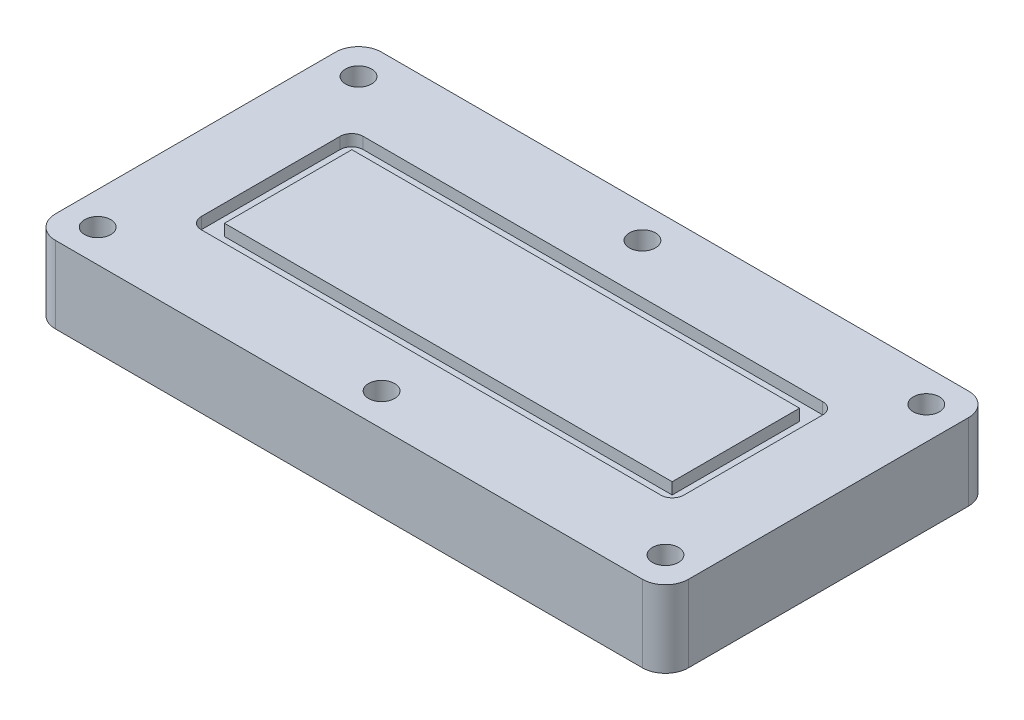
ISO-10303-21;
HEADER;
FILE_DESCRIPTION(('STEP AP214'),'2;1');
FILE_NAME('part.step','',(''),(''),'','','');
FILE_SCHEMA(('AUTOMOTIVE_DESIGN { 1 0 10303 214 1 1 1 1 }'));
ENDSEC;
DATA;
#1=APPLICATION_CONTEXT('core data for automotive mechanical design processes');
#2=APPLICATION_PROTOCOL_DEFINITION('international standard','automotive_design',2000,#1);
#3=PRODUCT_CONTEXT('',#1,'mechanical');
#4=PRODUCT('Part','Part','',(#3));
#5=PRODUCT_RELATED_PRODUCT_CATEGORY('part','',(#4));
#6=PRODUCT_DEFINITION_FORMATION('','',#4);
#7=PRODUCT_DEFINITION_CONTEXT('part definition',#1,'design');
#8=PRODUCT_DEFINITION('design','',#6,#7);
#9=PRODUCT_DEFINITION_SHAPE('','',#8);
#10=(LENGTH_UNIT() NAMED_UNIT(*) SI_UNIT(.MILLI.,.METRE.));
#11=(NAMED_UNIT(*) PLANE_ANGLE_UNIT() SI_UNIT($,.RADIAN.));
#12=(NAMED_UNIT(*) SI_UNIT($,.STERADIAN.) SOLID_ANGLE_UNIT());
#13=UNCERTAINTY_MEASURE_WITH_UNIT(LENGTH_MEASURE(1.E-05),#10,'distance_accuracy_value','');
#14=(GEOMETRIC_REPRESENTATION_CONTEXT(3) GLOBAL_UNCERTAINTY_ASSIGNED_CONTEXT((#13)) GLOBAL_UNIT_ASSIGNED_CONTEXT((#10,
#11,#12)) REPRESENTATION_CONTEXT('',''));
#15=CARTESIAN_POINT('',(0.,0.,0.));
#16=DIRECTION('',(0.,0.,1.));
#17=DIRECTION('',(1.,0.,0.));
#18=AXIS2_PLACEMENT_3D('',#15,#16,#17);
#19=CARTESIAN_POINT('',(-46.99,12.7,21.59));
#20=DIRECTION('',(0.,-1.,0.));
#21=DIRECTION('',(0.,0.,-1.));
#22=AXIS2_PLACEMENT_3D('',#19,#20,#21);
#23=CYLINDRICAL_SURFACE('',#22,2.159);
#24=CARTESIAN_POINT('',(-46.99,12.7,21.59));
#25=DIRECTION('',(0.,-1.,0.));
#26=DIRECTION('',(0.,0.,-1.));
#27=AXIS2_PLACEMENT_3D('',#24,#25,#26);
#28=CIRCLE('',#27,2.159);
#29=CARTESIAN_POINT('',(-46.99,12.7,19.431));
#30=VERTEX_POINT('',#29);
#31=EDGE_CURVE('E220',#30,#30,#28,.T.);
#32=ORIENTED_EDGE('',*,*,#31,.F.);
#33=EDGE_LOOP('',(#32));
#34=FACE_BOUND('',#33,.T.);
#35=CARTESIAN_POINT('',(-46.99,4.572,21.59));
#36=DIRECTION('',(0.,-1.,0.));
#37=DIRECTION('',(0.,0.,-1.));
#38=AXIS2_PLACEMENT_3D('',#35,#36,#37);
#39=CIRCLE('',#38,2.159);
#40=CARTESIAN_POINT('',(-46.99,4.572,19.431));
#41=VERTEX_POINT('',#40);
#42=EDGE_CURVE('E377',#41,#41,#39,.F.);
#43=ORIENTED_EDGE('',*,*,#42,.F.);
#44=EDGE_LOOP('',(#43));
#45=FACE_BOUND('',#44,.T.);
#46=ADVANCED_FACE('F43',(#34,#45),#23,.F.);
#47=CARTESIAN_POINT('',(0.,12.7,-21.59));
#48=DIRECTION('',(0.,-1.,0.));
#49=DIRECTION('',(0.,0.,-1.));
#50=AXIS2_PLACEMENT_3D('',#47,#48,#49);
#51=CYLINDRICAL_SURFACE('',#50,2.159);
#52=CARTESIAN_POINT('',(0.,12.7,-21.59));
#53=DIRECTION('',(0.,-1.,0.));
#54=DIRECTION('',(0.,0.,-1.));
#55=AXIS2_PLACEMENT_3D('',#52,#53,#54);
#56=CIRCLE('',#55,2.159);
#57=CARTESIAN_POINT('',(0.,12.7,-23.749));
#58=VERTEX_POINT('',#57);
#59=EDGE_CURVE('E381',#58,#58,#56,.T.);
#60=ORIENTED_EDGE('',*,*,#59,.F.);
#61=EDGE_LOOP('',(#60));
#62=FACE_BOUND('',#61,.T.);
#63=CARTESIAN_POINT('',(0.,4.572,-21.59));
#64=DIRECTION('',(0.,-1.,0.));
#65=DIRECTION('',(0.,0.,-1.));
#66=AXIS2_PLACEMENT_3D('',#63,#64,#65);
#67=CIRCLE('',#66,2.159);
#68=CARTESIAN_POINT('',(0.,4.572,-23.749));
#69=VERTEX_POINT('',#68);
#70=EDGE_CURVE('E373',#69,#69,#67,.F.);
#71=ORIENTED_EDGE('',*,*,#70,.F.);
#72=EDGE_LOOP('',(#71));
#73=FACE_BOUND('',#72,.T.);
#74=ADVANCED_FACE('F465',(#62,#73),#51,.F.);
#75=CARTESIAN_POINT('',(46.99,12.7,21.59));
#76=DIRECTION('',(0.,-1.,0.));
#77=DIRECTION('',(0.,0.,-1.));
#78=AXIS2_PLACEMENT_3D('',#75,#76,#77);
#79=CYLINDRICAL_SURFACE('',#78,2.159);
#80=CARTESIAN_POINT('',(46.99,12.7,21.59));
#81=DIRECTION('',(0.,-1.,0.));
#82=DIRECTION('',(0.,0.,-1.));
#83=AXIS2_PLACEMENT_3D('',#80,#81,#82);
#84=CIRCLE('',#83,2.159);
#85=CARTESIAN_POINT('',(46.99,12.7,19.431));
#86=VERTEX_POINT('',#85);
#87=EDGE_CURVE('E576',#86,#86,#84,.T.);
#88=ORIENTED_EDGE('',*,*,#87,.F.);
#89=EDGE_LOOP('',(#88));
#90=FACE_BOUND('',#89,.T.);
#91=CARTESIAN_POINT('',(46.99,4.572,21.59));
#92=DIRECTION('',(0.,-1.,0.));
#93=DIRECTION('',(0.,0.,-1.));
#94=AXIS2_PLACEMENT_3D('',#91,#92,#93);
#95=CIRCLE('',#94,2.159);
#96=CARTESIAN_POINT('',(46.99,4.572,19.431));
#97=VERTEX_POINT('',#96);
#98=EDGE_CURVE('E369',#97,#97,#95,.F.);
#99=ORIENTED_EDGE('',*,*,#98,.F.);
#100=EDGE_LOOP('',(#99));
#101=FACE_BOUND('',#100,.T.);
#102=ADVANCED_FACE('F471',(#90,#101),#79,.F.);
#103=CARTESIAN_POINT('',(-46.99,12.7,-21.59));
#104=DIRECTION('',(0.,-1.,0.));
#105=DIRECTION('',(0.,0.,-1.));
#106=AXIS2_PLACEMENT_3D('',#103,#104,#105);
#107=CYLINDRICAL_SURFACE('',#106,2.159);
#108=CARTESIAN_POINT('',(-46.99,12.7,-21.59));
#109=DIRECTION('',(0.,-1.,0.));
#110=DIRECTION('',(0.,0.,-1.));
#111=AXIS2_PLACEMENT_3D('',#108,#109,#110);
#112=CIRCLE('',#111,2.159);
#113=CARTESIAN_POINT('',(-46.99,12.7,-23.749));
#114=VERTEX_POINT('',#113);
#115=EDGE_CURVE('E647',#114,#114,#112,.T.);
#116=ORIENTED_EDGE('',*,*,#115,.F.);
#117=EDGE_LOOP('',(#116));
#118=FACE_BOUND('',#117,.T.);
#119=CARTESIAN_POINT('',(-46.99,4.572,-21.59));
#120=DIRECTION('',(0.,-1.,0.));
#121=DIRECTION('',(0.,0.,-1.));
#122=AXIS2_PLACEMENT_3D('',#119,#120,#121);
#123=CIRCLE('',#122,2.159);
#124=CARTESIAN_POINT('',(-46.99,4.572,-23.749));
#125=VERTEX_POINT('',#124);
#126=EDGE_CURVE('E365',#125,#125,#123,.F.);
#127=ORIENTED_EDGE('',*,*,#126,.F.);
#128=EDGE_LOOP('',(#127));
#129=FACE_BOUND('',#128,.T.);
#130=ADVANCED_FACE('F478',(#118,#129),#107,.F.);
#131=CARTESIAN_POINT('',(46.99,12.7,-21.59));
#132=DIRECTION('',(0.,-1.,0.));
#133=DIRECTION('',(0.,0.,-1.));
#134=AXIS2_PLACEMENT_3D('',#131,#132,#133);
#135=CYLINDRICAL_SURFACE('',#134,2.159);
#136=CARTESIAN_POINT('',(46.99,12.7,-21.59));
#137=DIRECTION('',(0.,-1.,0.));
#138=DIRECTION('',(0.,0.,-1.));
#139=AXIS2_PLACEMENT_3D('',#136,#137,#138);
#140=CIRCLE('',#139,2.159);
#141=CARTESIAN_POINT('',(46.99,12.7,-23.749));
#142=VERTEX_POINT('',#141);
#143=EDGE_CURVE('E643',#142,#142,#140,.T.);
#144=ORIENTED_EDGE('',*,*,#143,.F.);
#145=EDGE_LOOP('',(#144));
#146=FACE_BOUND('',#145,.T.);
#147=CARTESIAN_POINT('',(46.99,4.572,-21.59));
#148=DIRECTION('',(0.,-1.,0.));
#149=DIRECTION('',(0.,0.,-1.));
#150=AXIS2_PLACEMENT_3D('',#147,#148,#149);
#151=CIRCLE('',#150,2.159);
#152=CARTESIAN_POINT('',(46.99,4.572,-23.749));
#153=VERTEX_POINT('',#152);
#154=EDGE_CURVE('E360',#153,#153,#151,.F.);
#155=ORIENTED_EDGE('',*,*,#154,.F.);
#156=EDGE_LOOP('',(#155));
#157=FACE_BOUND('',#156,.T.);
#158=ADVANCED_FACE('F561',(#146,#157),#135,.F.);
#159=CARTESIAN_POINT('',(0.,12.7,21.59));
#160=DIRECTION('',(0.,-1.,0.));
#161=DIRECTION('',(0.,0.,-1.));
#162=AXIS2_PLACEMENT_3D('',#159,#160,#161);
#163=CYLINDRICAL_SURFACE('',#162,2.159);
#164=CARTESIAN_POINT('',(0.,12.7,21.59));
#165=DIRECTION('',(0.,-1.,0.));
#166=DIRECTION('',(0.,0.,-1.));
#167=AXIS2_PLACEMENT_3D('',#164,#165,#166);
#168=CIRCLE('',#167,2.159);
#169=CARTESIAN_POINT('',(0.,12.7,19.431));
#170=VERTEX_POINT('',#169);
#171=EDGE_CURVE('E642',#170,#170,#168,.T.);
#172=ORIENTED_EDGE('',*,*,#171,.F.);
#173=EDGE_LOOP('',(#172));
#174=FACE_BOUND('',#173,.T.);
#175=CARTESIAN_POINT('',(0.,4.572,21.59));
#176=DIRECTION('',(0.,-1.,0.));
#177=DIRECTION('',(0.,0.,-1.));
#178=AXIS2_PLACEMENT_3D('',#175,#176,#177);
#179=CIRCLE('',#178,2.159);
#180=CARTESIAN_POINT('',(0.,4.572,19.431));
#181=VERTEX_POINT('',#180);
#182=EDGE_CURVE('E356',#181,#181,#179,.F.);
#183=ORIENTED_EDGE('',*,*,#182,.F.);
#184=EDGE_LOOP('',(#183));
#185=FACE_BOUND('',#184,.T.);
#186=ADVANCED_FACE('F525',(#174,#185),#163,.F.);
#187=CARTESIAN_POINT('',(52.3875,12.7,26.9875));
#188=DIRECTION('',(-1.,0.,0.));
#189=DIRECTION('',(0.,0.,1.));
#190=AXIS2_PLACEMENT_3D('',#187,#188,#189);
#191=PLANE('',#190);
#192=DIRECTION('',(0.,0.,-1.));
#193=VECTOR('',#192,1.);
#194=CARTESIAN_POINT('',(52.3875,12.7,26.9875));
#195=LINE('',#194,#193);
#196=CARTESIAN_POINT('',(52.3875,12.7,23.1775));
#197=VERTEX_POINT('',#196);
#198=CARTESIAN_POINT('',(52.3875,12.7,-23.1775));
#199=VERTEX_POINT('',#198);
#200=EDGE_CURVE('E275',#197,#199,#195,.T.);
#201=ORIENTED_EDGE('',*,*,#200,.F.);
#202=DIRECTION('',(0.,-1.,0.));
#203=VECTOR('',#202,1.);
#204=CARTESIAN_POINT('',(52.3875,12.7,23.1775));
#205=LINE('',#204,#203);
#206=CARTESIAN_POINT('',(52.3875,0.,23.1775));
#207=VERTEX_POINT('',#206);
#208=EDGE_CURVE('E11',#197,#207,#205,.T.);
#209=ORIENTED_EDGE('',*,*,#208,.T.);
#210=DIRECTION('',(0.,0.,-1.));
#211=VECTOR('',#210,1.);
#212=CARTESIAN_POINT('',(52.3875,0.,26.9875));
#213=LINE('',#212,#211);
#214=CARTESIAN_POINT('',(52.3875,0.,-23.1775));
#215=VERTEX_POINT('',#214);
#216=EDGE_CURVE('E260',#207,#215,#213,.T.);
#217=ORIENTED_EDGE('',*,*,#216,.T.);
#218=DIRECTION('',(0.,-1.,0.));
#219=VECTOR('',#218,1.);
#220=CARTESIAN_POINT('',(52.3875,12.7,-23.1775));
#221=LINE('',#220,#219);
#222=EDGE_CURVE('E52',#215,#199,#221,.F.);
#223=ORIENTED_EDGE('',*,*,#222,.T.);
#224=EDGE_LOOP('',(#201,#209,#217,#223));
#225=FACE_BOUND('',#224,.T.);
#226=ADVANCED_FACE('F427',(#225),#191,.F.);
#227=CARTESIAN_POINT('',(-52.3875,12.7,-26.9875));
#228=DIRECTION('',(0.,0.,1.));
#229=DIRECTION('',(1.,0.,0.));
#230=AXIS2_PLACEMENT_3D('',#227,#228,#229);
#231=PLANE('',#230);
#232=DIRECTION('',(-1.,0.,0.));
#233=VECTOR('',#232,1.);
#234=CARTESIAN_POINT('',(-52.3875,0.,-26.9875));
#235=LINE('',#234,#233);
#236=CARTESIAN_POINT('',(48.5775,0.,-26.9875));
#237=VERTEX_POINT('',#236);
#238=CARTESIAN_POINT('',(-48.5775,0.,-26.9875));
#239=VERTEX_POINT('',#238);
#240=EDGE_CURVE('E294',#237,#239,#235,.T.);
#241=ORIENTED_EDGE('',*,*,#240,.T.);
#242=DIRECTION('',(0.,-1.,0.));
#243=VECTOR('',#242,1.);
#244=CARTESIAN_POINT('',(-48.5775,12.7,-26.9875));
#245=LINE('',#244,#243);
#246=CARTESIAN_POINT('',(-48.5775,12.7,-26.9875));
#247=VERTEX_POINT('',#246);
#248=EDGE_CURVE('E59',#239,#247,#245,.F.);
#249=ORIENTED_EDGE('',*,*,#248,.T.);
#250=DIRECTION('',(-1.,0.,0.));
#251=VECTOR('',#250,1.);
#252=CARTESIAN_POINT('',(-52.3875,12.7,-26.9875));
#253=LINE('',#252,#251);
#254=CARTESIAN_POINT('',(48.5775,12.7,-26.9875));
#255=VERTEX_POINT('',#254);
#256=EDGE_CURVE('E278',#255,#247,#253,.T.);
#257=ORIENTED_EDGE('',*,*,#256,.F.);
#258=DIRECTION('',(0.,-1.,0.));
#259=VECTOR('',#258,1.);
#260=CARTESIAN_POINT('',(48.5775,12.7,-26.9875));
#261=LINE('',#260,#259);
#262=EDGE_CURVE('E418',#255,#237,#261,.T.);
#263=ORIENTED_EDGE('',*,*,#262,.T.);
#264=EDGE_LOOP('',(#241,#249,#257,#263));
#265=FACE_BOUND('',#264,.T.);
#266=ADVANCED_FACE('F435',(#265),#231,.F.);
#267=CARTESIAN_POINT('',(-52.3875,12.7,26.9875));
#268=DIRECTION('',(1.,0.,0.));
#269=DIRECTION('',(0.,0.,-1.));
#270=AXIS2_PLACEMENT_3D('',#267,#268,#269);
#271=PLANE('',#270);
#272=DIRECTION('',(0.,0.,1.));
#273=VECTOR('',#272,1.);
#274=CARTESIAN_POINT('',(-52.3875,0.,26.9875));
#275=LINE('',#274,#273);
#276=CARTESIAN_POINT('',(-52.3875,0.,-23.1775));
#277=VERTEX_POINT('',#276);
#278=CARTESIAN_POINT('',(-52.3875,0.,23.1775));
#279=VERTEX_POINT('',#278);
#280=EDGE_CURVE('E297',#277,#279,#275,.T.);
#281=ORIENTED_EDGE('',*,*,#280,.T.);
#282=DIRECTION('',(0.,-1.,0.));
#283=VECTOR('',#282,1.);
#284=CARTESIAN_POINT('',(-52.3875,12.7,23.1775));
#285=LINE('',#284,#283);
#286=CARTESIAN_POINT('',(-52.3875,12.7,23.1775));
#287=VERTEX_POINT('',#286);
#288=EDGE_CURVE('E404',#279,#287,#285,.F.);
#289=ORIENTED_EDGE('',*,*,#288,.T.);
#290=DIRECTION('',(0.,0.,1.));
#291=VECTOR('',#290,1.);
#292=CARTESIAN_POINT('',(-52.3875,12.7,26.9875));
#293=LINE('',#292,#291);
#294=CARTESIAN_POINT('',(-52.3875,12.7,-23.1775));
#295=VERTEX_POINT('',#294);
#296=EDGE_CURVE('E282',#295,#287,#293,.T.);
#297=ORIENTED_EDGE('',*,*,#296,.F.);
#298=DIRECTION('',(0.,-1.,0.));
#299=VECTOR('',#298,1.);
#300=CARTESIAN_POINT('',(-52.3875,12.7,-23.1775));
#301=LINE('',#300,#299);
#302=EDGE_CURVE('E400',#295,#277,#301,.T.);
#303=ORIENTED_EDGE('',*,*,#302,.T.);
#304=EDGE_LOOP('',(#281,#289,#297,#303));
#305=FACE_BOUND('',#304,.T.);
#306=ADVANCED_FACE('F446',(#305),#271,.F.);
#307=CARTESIAN_POINT('',(-52.3875,12.7,26.9875));
#308=DIRECTION('',(0.,0.,-1.));
#309=DIRECTION('',(-1.,0.,0.));
#310=AXIS2_PLACEMENT_3D('',#307,#308,#309);
#311=PLANE('',#310);
#312=DIRECTION('',(1.,0.,0.));
#313=VECTOR('',#312,1.);
#314=CARTESIAN_POINT('',(-52.3875,12.7,26.9875));
#315=LINE('',#314,#313);
#316=CARTESIAN_POINT('',(-48.5775,12.7,26.9875));
#317=VERTEX_POINT('',#316);
#318=CARTESIAN_POINT('',(48.5775,12.7,26.9875));
#319=VERTEX_POINT('',#318);
#320=EDGE_CURVE('E286',#317,#319,#315,.T.);
#321=ORIENTED_EDGE('',*,*,#320,.F.);
#322=DIRECTION('',(0.,-1.,0.));
#323=VECTOR('',#322,1.);
#324=CARTESIAN_POINT('',(-48.5775,12.7,26.9875));
#325=LINE('',#324,#323);
#326=CARTESIAN_POINT('',(-48.5775,0.,26.9875));
#327=VERTEX_POINT('',#326);
#328=EDGE_CURVE('E384',#317,#327,#325,.T.);
#329=ORIENTED_EDGE('',*,*,#328,.T.);
#330=DIRECTION('',(1.,0.,0.));
#331=VECTOR('',#330,1.);
#332=CARTESIAN_POINT('',(-52.3875,0.,26.9875));
#333=LINE('',#332,#331);
#334=CARTESIAN_POINT('',(48.5775,0.,26.9875));
#335=VERTEX_POINT('',#334);
#336=EDGE_CURVE('E279',#327,#335,#333,.T.);
#337=ORIENTED_EDGE('',*,*,#336,.T.);
#338=DIRECTION('',(0.,-1.,0.));
#339=VECTOR('',#338,1.);
#340=CARTESIAN_POINT('',(48.5775,12.7,26.9875));
#341=LINE('',#340,#339);
#342=EDGE_CURVE('E355',#335,#319,#341,.F.);
#343=ORIENTED_EDGE('',*,*,#342,.T.);
#344=EDGE_LOOP('',(#321,#329,#337,#343));
#345=FACE_BOUND('',#344,.T.);
#346=ADVANCED_FACE('F454',(#345),#311,.F.);
#347=CARTESIAN_POINT('',(0.,12.7,0.));
#348=DIRECTION('',(0.,-1.,0.));
#349=DIRECTION('',(0.,0.,-1.));
#350=AXIS2_PLACEMENT_3D('',#347,#348,#349);
#351=PLANE('',#350);
#352=ORIENTED_EDGE('',*,*,#171,.T.);
#353=EDGE_LOOP('',(#352));
#354=FACE_BOUND('',#353,.T.);
#355=ORIENTED_EDGE('',*,*,#143,.T.);
#356=EDGE_LOOP('',(#355));
#357=FACE_BOUND('',#356,.T.);
#358=ORIENTED_EDGE('',*,*,#115,.T.);
#359=EDGE_LOOP('',(#358));
#360=FACE_BOUND('',#359,.T.);
#361=ORIENTED_EDGE('',*,*,#87,.T.);
#362=EDGE_LOOP('',(#361));
#363=FACE_BOUND('',#362,.T.);
#364=ORIENTED_EDGE('',*,*,#59,.T.);
#365=EDGE_LOOP('',(#364));
#366=FACE_BOUND('',#365,.T.);
#367=ORIENTED_EDGE('',*,*,#31,.T.);
#368=EDGE_LOOP('',(#367));
#369=FACE_BOUND('',#368,.T.);
#370=DIRECTION('',(-1.,0.,0.));
#371=VECTOR('',#370,1.);
#372=CARTESIAN_POINT('',(-39.9415,12.7,-13.3985));
#373=LINE('',#372,#371);
#374=CARTESIAN_POINT('',(38.0365,12.7,-13.3985));
#375=VERTEX_POINT('',#374);
#376=CARTESIAN_POINT('',(-38.0365,12.7,-13.3985));
#377=VERTEX_POINT('',#376);
#378=EDGE_CURVE('E264',#375,#377,#373,.T.);
#379=ORIENTED_EDGE('',*,*,#378,.F.);
#380=CARTESIAN_POINT('',(38.0365,12.7,-11.4935));
#381=DIRECTION('',(0.,-1.,0.));
#382=DIRECTION('',(0.,0.,-1.));
#383=AXIS2_PLACEMENT_3D('',#380,#381,#382);
#384=CIRCLE('',#383,1.905);
#385=CARTESIAN_POINT('',(39.9415,12.7,-11.4935));
#386=VERTEX_POINT('',#385);
#387=EDGE_CURVE('E346',#375,#386,#384,.T.);
#388=ORIENTED_EDGE('',*,*,#387,.T.);
#389=DIRECTION('',(0.,0.,-1.));
#390=VECTOR('',#389,1.);
#391=CARTESIAN_POINT('',(39.9415,12.7,13.3985));
#392=LINE('',#391,#390);
#393=CARTESIAN_POINT('',(39.9415,12.7,11.4935));
#394=VERTEX_POINT('',#393);
#395=EDGE_CURVE('E237',#394,#386,#392,.T.);
#396=ORIENTED_EDGE('',*,*,#395,.F.);
#397=CARTESIAN_POINT('',(38.0365,12.7,11.4935));
#398=DIRECTION('',(0.,-1.,0.));
#399=DIRECTION('',(0.,0.,-1.));
#400=AXIS2_PLACEMENT_3D('',#397,#398,#399);
#401=CIRCLE('',#400,1.905);
#402=CARTESIAN_POINT('',(38.0365,12.7,13.3985));
#403=VERTEX_POINT('',#402);
#404=EDGE_CURVE('E343',#394,#403,#401,.T.);
#405=ORIENTED_EDGE('',*,*,#404,.T.);
#406=DIRECTION('',(1.,0.,0.));
#407=VECTOR('',#406,1.);
#408=CARTESIAN_POINT('',(-39.9415,12.7,13.3985));
#409=LINE('',#408,#407);
#410=CARTESIAN_POINT('',(-38.0365,12.7,13.3985));
#411=VERTEX_POINT('',#410);
#412=EDGE_CURVE('E248',#411,#403,#409,.T.);
#413=ORIENTED_EDGE('',*,*,#412,.F.);
#414=CARTESIAN_POINT('',(-38.0365,12.7,11.4935));
#415=DIRECTION('',(0.,-1.,0.));
#416=DIRECTION('',(0.,0.,-1.));
#417=AXIS2_PLACEMENT_3D('',#414,#415,#416);
#418=CIRCLE('',#417,1.905);
#419=CARTESIAN_POINT('',(-39.9415,12.7,11.4935));
#420=VERTEX_POINT('',#419);
#421=EDGE_CURVE('E349',#411,#420,#418,.T.);
#422=ORIENTED_EDGE('',*,*,#421,.T.);
#423=DIRECTION('',(0.,0.,1.));
#424=VECTOR('',#423,1.);
#425=CARTESIAN_POINT('',(-39.9415,12.7,13.3985));
#426=LINE('',#425,#424);
#427=CARTESIAN_POINT('',(-39.9415,12.7,-11.4935));
#428=VERTEX_POINT('',#427);
#429=EDGE_CURVE('E268',#428,#420,#426,.T.);
#430=ORIENTED_EDGE('',*,*,#429,.F.);
#431=CARTESIAN_POINT('',(-38.0365,12.7,-11.4935));
#432=DIRECTION('',(0.,-1.,0.));
#433=DIRECTION('',(0.,0.,-1.));
#434=AXIS2_PLACEMENT_3D('',#431,#432,#433);
#435=CIRCLE('',#434,1.905);
#436=EDGE_CURVE('E352',#428,#377,#435,.T.);
#437=ORIENTED_EDGE('',*,*,#436,.T.);
#438=EDGE_LOOP('',(#379,#388,#396,#405,#413,#422,#430,#437));
#439=FACE_BOUND('',#438,.T.);
#440=ORIENTED_EDGE('',*,*,#296,.T.);
#441=CARTESIAN_POINT('',(-48.5775,12.7,23.1775));
#442=DIRECTION('',(0.,-1.,0.));
#443=DIRECTION('',(0.,0.,-1.));
#444=AXIS2_PLACEMENT_3D('',#441,#442,#443);
#445=CIRCLE('',#444,3.81);
#446=EDGE_CURVE('E415',#287,#317,#445,.F.);
#447=ORIENTED_EDGE('',*,*,#446,.T.);
#448=ORIENTED_EDGE('',*,*,#320,.T.);
#449=CARTESIAN_POINT('',(48.5775,12.7,23.1775));
#450=DIRECTION('',(0.,-1.,0.));
#451=DIRECTION('',(0.,0.,-1.));
#452=AXIS2_PLACEMENT_3D('',#449,#450,#451);
#453=CIRCLE('',#452,3.81);
#454=EDGE_CURVE('E409',#319,#197,#453,.F.);
#455=ORIENTED_EDGE('',*,*,#454,.T.);
#456=ORIENTED_EDGE('',*,*,#200,.T.);
#457=CARTESIAN_POINT('',(48.5775,12.7,-23.1775));
#458=DIRECTION('',(0.,-1.,0.));
#459=DIRECTION('',(0.,0.,-1.));
#460=AXIS2_PLACEMENT_3D('',#457,#458,#459);
#461=CIRCLE('',#460,3.81);
#462=EDGE_CURVE('E66',#199,#255,#461,.F.);
#463=ORIENTED_EDGE('',*,*,#462,.T.);
#464=ORIENTED_EDGE('',*,*,#256,.T.);
#465=CARTESIAN_POINT('',(-48.5775,12.7,-23.1775));
#466=DIRECTION('',(0.,-1.,0.));
#467=DIRECTION('',(0.,0.,-1.));
#468=AXIS2_PLACEMENT_3D('',#465,#466,#467);
#469=CIRCLE('',#468,3.81);
#470=EDGE_CURVE('E412',#247,#295,#469,.F.);
#471=ORIENTED_EDGE('',*,*,#470,.T.);
#472=EDGE_LOOP('',(#440,#447,#448,#455,#456,#463,#464,#471));
#473=FACE_BOUND('',#472,.T.);
#474=ADVANCED_FACE('F431',(#354,#357,#360,#363,#366,#369,#439,#473),#351,.F.);
#475=CARTESIAN_POINT('',(0.,0.,0.));
#476=DIRECTION('',(0.,-1.,0.));
#477=DIRECTION('',(0.,0.,-1.));
#478=AXIS2_PLACEMENT_3D('',#475,#476,#477);
#479=PLANE('',#478);
#480=CARTESIAN_POINT('',(-46.99,0.,-21.59));
#481=DIRECTION('',(0.,-1.,0.));
#482=DIRECTION('',(0.,0.,-1.));
#483=AXIS2_PLACEMENT_3D('',#480,#481,#482);
#484=CIRCLE('',#483,3.6195);
#485=CARTESIAN_POINT('',(-46.99,0.,-25.2095));
#486=VERTEX_POINT('',#485);
#487=EDGE_CURVE('E623',#486,#486,#484,.T.);
#488=ORIENTED_EDGE('',*,*,#487,.F.);
#489=EDGE_LOOP('',(#488));
#490=FACE_BOUND('',#489,.T.);
#491=CARTESIAN_POINT('',(0.,0.,-21.59));
#492=DIRECTION('',(0.,-1.,0.));
#493=DIRECTION('',(0.,0.,-1.));
#494=AXIS2_PLACEMENT_3D('',#491,#492,#493);
#495=CIRCLE('',#494,3.6195);
#496=CARTESIAN_POINT('',(0.,0.,-25.2095));
#497=VERTEX_POINT('',#496);
#498=EDGE_CURVE('E708',#497,#497,#495,.T.);
#499=ORIENTED_EDGE('',*,*,#498,.F.);
#500=EDGE_LOOP('',(#499));
#501=FACE_BOUND('',#500,.T.);
#502=CARTESIAN_POINT('',(46.99,0.,-21.59));
#503=DIRECTION('',(0.,-1.,0.));
#504=DIRECTION('',(0.,0.,-1.));
#505=AXIS2_PLACEMENT_3D('',#502,#503,#504);
#506=CIRCLE('',#505,3.6195);
#507=CARTESIAN_POINT('',(46.99,0.,-25.2095));
#508=VERTEX_POINT('',#507);
#509=EDGE_CURVE('E700',#508,#508,#506,.T.);
#510=ORIENTED_EDGE('',*,*,#509,.F.);
#511=EDGE_LOOP('',(#510));
#512=FACE_BOUND('',#511,.T.);
#513=CARTESIAN_POINT('',(46.99,0.,21.59));
#514=DIRECTION('',(0.,-1.,0.));
#515=DIRECTION('',(0.,0.,-1.));
#516=AXIS2_PLACEMENT_3D('',#513,#514,#515);
#517=CIRCLE('',#516,3.6195);
#518=CARTESIAN_POINT('',(46.99,0.,17.9705));
#519=VERTEX_POINT('',#518);
#520=EDGE_CURVE('E693',#519,#519,#517,.T.);
#521=ORIENTED_EDGE('',*,*,#520,.F.);
#522=EDGE_LOOP('',(#521));
#523=FACE_BOUND('',#522,.T.);
#524=CARTESIAN_POINT('',(0.,0.,21.59));
#525=DIRECTION('',(0.,-1.,0.));
#526=DIRECTION('',(0.,0.,-1.));
#527=AXIS2_PLACEMENT_3D('',#524,#525,#526);
#528=CIRCLE('',#527,3.6195);
#529=CARTESIAN_POINT('',(0.,0.,17.9705));
#530=VERTEX_POINT('',#529);
#531=EDGE_CURVE('E638',#530,#530,#528,.T.);
#532=ORIENTED_EDGE('',*,*,#531,.F.);
#533=EDGE_LOOP('',(#532));
#534=FACE_BOUND('',#533,.T.);
#535=CARTESIAN_POINT('',(-46.99,0.,21.59));
#536=DIRECTION('',(0.,-1.,0.));
#537=DIRECTION('',(0.,0.,-1.));
#538=AXIS2_PLACEMENT_3D('',#535,#536,#537);
#539=CIRCLE('',#538,3.6195);
#540=CARTESIAN_POINT('',(-46.99,0.,17.9705));
#541=VERTEX_POINT('',#540);
#542=EDGE_CURVE('E634',#541,#541,#539,.T.);
#543=ORIENTED_EDGE('',*,*,#542,.F.);
#544=EDGE_LOOP('',(#543));
#545=FACE_BOUND('',#544,.T.);
#546=ORIENTED_EDGE('',*,*,#336,.F.);
#547=CARTESIAN_POINT('',(-48.5775,0.,23.1775));
#548=DIRECTION('',(0.,-1.,0.));
#549=DIRECTION('',(0.,0.,-1.));
#550=AXIS2_PLACEMENT_3D('',#547,#548,#549);
#551=CIRCLE('',#550,3.81);
#552=EDGE_CURVE('E397',#327,#279,#551,.T.);
#553=ORIENTED_EDGE('',*,*,#552,.T.);
#554=ORIENTED_EDGE('',*,*,#280,.F.);
#555=CARTESIAN_POINT('',(-48.5775,0.,-23.1775));
#556=DIRECTION('',(0.,-1.,0.));
#557=DIRECTION('',(0.,0.,-1.));
#558=AXIS2_PLACEMENT_3D('',#555,#556,#557);
#559=CIRCLE('',#558,3.81);
#560=EDGE_CURVE('E394',#277,#239,#559,.T.);
#561=ORIENTED_EDGE('',*,*,#560,.T.);
#562=ORIENTED_EDGE('',*,*,#240,.F.);
#563=CARTESIAN_POINT('',(48.5775,0.,-23.1775));
#564=DIRECTION('',(0.,-1.,0.));
#565=DIRECTION('',(0.,0.,-1.));
#566=AXIS2_PLACEMENT_3D('',#563,#564,#565);
#567=CIRCLE('',#566,3.81);
#568=EDGE_CURVE('E388',#237,#215,#567,.T.);
#569=ORIENTED_EDGE('',*,*,#568,.T.);
#570=ORIENTED_EDGE('',*,*,#216,.F.);
#571=CARTESIAN_POINT('',(48.5775,0.,23.1775));
#572=DIRECTION('',(0.,-1.,0.));
#573=DIRECTION('',(0.,0.,-1.));
#574=AXIS2_PLACEMENT_3D('',#571,#572,#573);
#575=CIRCLE('',#574,3.81);
#576=EDGE_CURVE('E391',#207,#335,#575,.T.);
#577=ORIENTED_EDGE('',*,*,#576,.T.);
#578=EDGE_LOOP('',(#546,#553,#554,#561,#562,#569,#570,#577));
#579=FACE_BOUND('',#578,.T.);
#580=ADVANCED_FACE('F438',(#490,#501,#512,#523,#534,#545,#579),#479,.T.);
#581=CARTESIAN_POINT('',(39.9415,10.795,13.3985));
#582=DIRECTION('',(1.,0.,0.));
#583=DIRECTION('',(0.,0.,-1.));
#584=AXIS2_PLACEMENT_3D('',#581,#582,#583);
#585=PLANE('',#584);
#586=DIRECTION('',(0.,0.,-1.));
#587=VECTOR('',#586,1.);
#588=CARTESIAN_POINT('',(39.9415,10.795,13.3985));
#589=LINE('',#588,#587);
#590=CARTESIAN_POINT('',(39.9415,10.795,11.4935));
#591=VERTEX_POINT('',#590);
#592=CARTESIAN_POINT('',(39.9415,10.795,-11.4935));
#593=VERTEX_POINT('',#592);
#594=EDGE_CURVE('E243',#591,#593,#589,.T.);
#595=ORIENTED_EDGE('',*,*,#594,.F.);
#596=DIRECTION('',(0.,1.,0.));
#597=VECTOR('',#596,1.);
#598=CARTESIAN_POINT('',(39.9415,12.7,11.4935));
#599=LINE('',#598,#597);
#600=EDGE_CURVE('E306',#591,#394,#599,.T.);
#601=ORIENTED_EDGE('',*,*,#600,.T.);
#602=ORIENTED_EDGE('',*,*,#395,.T.);
#603=DIRECTION('',(0.,1.,0.));
#604=VECTOR('',#603,1.);
#605=CARTESIAN_POINT('',(39.9415,10.795,-11.4935));
#606=LINE('',#605,#604);
#607=EDGE_CURVE('E290',#386,#593,#606,.F.);
#608=ORIENTED_EDGE('',*,*,#607,.T.);
#609=EDGE_LOOP('',(#595,#601,#602,#608));
#610=FACE_BOUND('',#609,.T.);
#611=ADVANCED_FACE('F500',(#610),#585,.F.);
#612=CARTESIAN_POINT('',(-39.9415,10.795,13.3985));
#613=DIRECTION('',(0.,0.,1.));
#614=DIRECTION('',(1.,0.,0.));
#615=AXIS2_PLACEMENT_3D('',#612,#613,#614);
#616=PLANE('',#615);
#617=ORIENTED_EDGE('',*,*,#412,.T.);
#618=DIRECTION('',(0.,1.,0.));
#619=VECTOR('',#618,1.);
#620=CARTESIAN_POINT('',(38.0365,10.795,13.3985));
#621=LINE('',#620,#619);
#622=CARTESIAN_POINT('',(38.0365,10.795,13.3985));
#623=VERTEX_POINT('',#622);
#624=EDGE_CURVE('E314',#403,#623,#621,.F.);
#625=ORIENTED_EDGE('',*,*,#624,.T.);
#626=DIRECTION('',(1.,0.,0.));
#627=VECTOR('',#626,1.);
#628=CARTESIAN_POINT('',(-39.9415,10.795,13.3985));
#629=LINE('',#628,#627);
#630=CARTESIAN_POINT('',(-38.0365,10.795,13.3985));
#631=VERTEX_POINT('',#630);
#632=EDGE_CURVE('E256',#631,#623,#629,.T.);
#633=ORIENTED_EDGE('',*,*,#632,.F.);
#634=DIRECTION('',(0.,1.,0.));
#635=VECTOR('',#634,1.);
#636=CARTESIAN_POINT('',(-38.0365,12.7,13.3985));
#637=LINE('',#636,#635);
#638=EDGE_CURVE('E310',#631,#411,#637,.T.);
#639=ORIENTED_EDGE('',*,*,#638,.T.);
#640=EDGE_LOOP('',(#617,#625,#633,#639));
#641=FACE_BOUND('',#640,.T.);
#642=ADVANCED_FACE('F496',(#641),#616,.F.);
#643=CARTESIAN_POINT('',(-39.9415,10.795,13.3985));
#644=DIRECTION('',(-1.,0.,0.));
#645=DIRECTION('',(0.,0.,1.));
#646=AXIS2_PLACEMENT_3D('',#643,#644,#645);
#647=PLANE('',#646);
#648=ORIENTED_EDGE('',*,*,#429,.T.);
#649=DIRECTION('',(0.,1.,0.));
#650=VECTOR('',#649,1.);
#651=CARTESIAN_POINT('',(-39.9415,10.795,11.4935));
#652=LINE('',#651,#650);
#653=CARTESIAN_POINT('',(-39.9415,10.795,11.4935));
#654=VERTEX_POINT('',#653);
#655=EDGE_CURVE('E340',#420,#654,#652,.F.);
#656=ORIENTED_EDGE('',*,*,#655,.T.);
#657=DIRECTION('',(0.,0.,1.));
#658=VECTOR('',#657,1.);
#659=CARTESIAN_POINT('',(-39.9415,10.795,13.3985));
#660=LINE('',#659,#658);
#661=CARTESIAN_POINT('',(-39.9415,10.795,-11.4935));
#662=VERTEX_POINT('',#661);
#663=EDGE_CURVE('E252',#662,#654,#660,.T.);
#664=ORIENTED_EDGE('',*,*,#663,.F.);
#665=DIRECTION('',(0.,1.,0.));
#666=VECTOR('',#665,1.);
#667=CARTESIAN_POINT('',(-39.9415,12.7,-11.4935));
#668=LINE('',#667,#666);
#669=EDGE_CURVE('E336',#662,#428,#668,.T.);
#670=ORIENTED_EDGE('',*,*,#669,.T.);
#671=EDGE_LOOP('',(#648,#656,#664,#670));
#672=FACE_BOUND('',#671,.T.);
#673=ADVANCED_FACE('F499',(#672),#647,.F.);
#674=CARTESIAN_POINT('',(-39.9415,10.795,-13.3985));
#675=DIRECTION('',(0.,0.,-1.));
#676=DIRECTION('',(-1.,0.,0.));
#677=AXIS2_PLACEMENT_3D('',#674,#675,#676);
#678=PLANE('',#677);
#679=DIRECTION('',(-1.,0.,0.));
#680=VECTOR('',#679,1.);
#681=CARTESIAN_POINT('',(-39.9415,10.795,-13.3985));
#682=LINE('',#681,#680);
#683=CARTESIAN_POINT('',(38.0365,10.795,-13.3985));
#684=VERTEX_POINT('',#683);
#685=CARTESIAN_POINT('',(-38.0365,10.795,-13.3985));
#686=VERTEX_POINT('',#685);
#687=EDGE_CURVE('E247',#684,#686,#682,.T.);
#688=ORIENTED_EDGE('',*,*,#687,.F.);
#689=DIRECTION('',(0.,1.,0.));
#690=VECTOR('',#689,1.);
#691=CARTESIAN_POINT('',(38.0365,12.7,-13.3985));
#692=LINE('',#691,#690);
#693=EDGE_CURVE('E332',#684,#375,#692,.T.);
#694=ORIENTED_EDGE('',*,*,#693,.T.);
#695=ORIENTED_EDGE('',*,*,#378,.T.);
#696=DIRECTION('',(0.,1.,0.));
#697=VECTOR('',#696,1.);
#698=CARTESIAN_POINT('',(-38.0365,10.795,-13.3985));
#699=LINE('',#698,#697);
#700=EDGE_CURVE('E329',#377,#686,#699,.F.);
#701=ORIENTED_EDGE('',*,*,#700,.T.);
#702=EDGE_LOOP('',(#688,#694,#695,#701));
#703=FACE_BOUND('',#702,.T.);
#704=ADVANCED_FACE('F495',(#703),#678,.F.);
#705=CARTESIAN_POINT('',(0.,10.795,0.));
#706=DIRECTION('',(0.,-1.,0.));
#707=DIRECTION('',(0.,0.,-1.));
#708=AXIS2_PLACEMENT_3D('',#705,#706,#707);
#709=PLANE('',#708);
#710=DIRECTION('',(0.,0.,-1.));
#711=VECTOR('',#710,1.);
#712=CARTESIAN_POINT('',(37.05225,10.795,10.541));
#713=LINE('',#712,#711);
#714=CARTESIAN_POINT('',(37.05225,10.795,10.541));
#715=VERTEX_POINT('',#714);
#716=CARTESIAN_POINT('',(37.05225,10.795,-10.541));
#717=VERTEX_POINT('',#716);
#718=EDGE_CURVE('E203',#715,#717,#713,.T.);
#719=ORIENTED_EDGE('',*,*,#718,.F.);
#720=DIRECTION('',(1.,0.,0.));
#721=VECTOR('',#720,1.);
#722=CARTESIAN_POINT('',(-37.05225,10.795,10.541));
#723=LINE('',#722,#721);
#724=CARTESIAN_POINT('',(-37.05225,10.795,10.541));
#725=VERTEX_POINT('',#724);
#726=EDGE_CURVE('E196',#725,#715,#723,.T.);
#727=ORIENTED_EDGE('',*,*,#726,.F.);
#728=DIRECTION('',(0.,0.,1.));
#729=VECTOR('',#728,1.);
#730=CARTESIAN_POINT('',(-37.05225,10.795,10.541));
#731=LINE('',#730,#729);
#732=CARTESIAN_POINT('',(-37.05225,10.795,-10.541));
#733=VERTEX_POINT('',#732);
#734=EDGE_CURVE('E206',#733,#725,#731,.T.);
#735=ORIENTED_EDGE('',*,*,#734,.F.);
#736=DIRECTION('',(-1.,0.,0.));
#737=VECTOR('',#736,1.);
#738=CARTESIAN_POINT('',(-37.05225,10.795,-10.541));
#739=LINE('',#738,#737);
#740=EDGE_CURVE('E187',#717,#733,#739,.T.);
#741=ORIENTED_EDGE('',*,*,#740,.F.);
#742=EDGE_LOOP('',(#719,#727,#735,#741));
#743=FACE_BOUND('',#742,.T.);
#744=ORIENTED_EDGE('',*,*,#632,.T.);
#745=CARTESIAN_POINT('',(38.0365,10.795,11.4935));
#746=DIRECTION('',(0.,-1.,0.));
#747=DIRECTION('',(0.,0.,-1.));
#748=AXIS2_PLACEMENT_3D('',#745,#746,#747);
#749=CIRCLE('',#748,1.905);
#750=EDGE_CURVE('E326',#623,#591,#749,.F.);
#751=ORIENTED_EDGE('',*,*,#750,.T.);
#752=ORIENTED_EDGE('',*,*,#594,.T.);
#753=CARTESIAN_POINT('',(38.0365,10.795,-11.4935));
#754=DIRECTION('',(0.,-1.,0.));
#755=DIRECTION('',(0.,0.,-1.));
#756=AXIS2_PLACEMENT_3D('',#753,#754,#755);
#757=CIRCLE('',#756,1.905);
#758=EDGE_CURVE('E323',#593,#684,#757,.F.);
#759=ORIENTED_EDGE('',*,*,#758,.T.);
#760=ORIENTED_EDGE('',*,*,#687,.T.);
#761=CARTESIAN_POINT('',(-38.0365,10.795,-11.4935));
#762=DIRECTION('',(0.,-1.,0.));
#763=DIRECTION('',(0.,0.,-1.));
#764=AXIS2_PLACEMENT_3D('',#761,#762,#763);
#765=CIRCLE('',#764,1.905);
#766=EDGE_CURVE('E317',#686,#662,#765,.F.);
#767=ORIENTED_EDGE('',*,*,#766,.T.);
#768=ORIENTED_EDGE('',*,*,#663,.T.);
#769=CARTESIAN_POINT('',(-38.0365,10.795,11.4935));
#770=DIRECTION('',(0.,-1.,0.));
#771=DIRECTION('',(0.,0.,-1.));
#772=AXIS2_PLACEMENT_3D('',#769,#770,#771);
#773=CIRCLE('',#772,1.905);
#774=EDGE_CURVE('E320',#654,#631,#773,.F.);
#775=ORIENTED_EDGE('',*,*,#774,.T.);
#776=EDGE_LOOP('',(#744,#751,#752,#759,#760,#767,#768,#775));
#777=FACE_BOUND('',#776,.T.);
#778=ADVANCED_FACE('F200',(#743,#777),#709,.F.);
#779=CARTESIAN_POINT('',(37.05225,10.795,10.541));
#780=DIRECTION('',(1.,0.,0.));
#781=DIRECTION('',(0.,0.,-1.));
#782=AXIS2_PLACEMENT_3D('',#779,#780,#781);
#783=PLANE('',#782);
#784=DIRECTION('',(0.,0.,-1.));
#785=VECTOR('',#784,1.);
#786=CARTESIAN_POINT('',(37.05225,12.7,10.541));
#787=LINE('',#786,#785);
#788=CARTESIAN_POINT('',(37.05225,12.7,10.541));
#789=VERTEX_POINT('',#788);
#790=CARTESIAN_POINT('',(37.05225,12.7,-10.541));
#791=VERTEX_POINT('',#790);
#792=EDGE_CURVE('E227',#789,#791,#787,.T.);
#793=ORIENTED_EDGE('',*,*,#792,.F.);
#794=DIRECTION('',(0.,1.,0.));
#795=VECTOR('',#794,1.);
#796=CARTESIAN_POINT('',(37.05225,10.795,10.541));
#797=LINE('',#796,#795);
#798=EDGE_CURVE('E211',#715,#789,#797,.T.);
#799=ORIENTED_EDGE('',*,*,#798,.F.);
#800=ORIENTED_EDGE('',*,*,#718,.T.);
#801=DIRECTION('',(0.,1.,0.));
#802=VECTOR('',#801,1.);
#803=CARTESIAN_POINT('',(37.05225,10.795,-10.541));
#804=LINE('',#803,#802);
#805=EDGE_CURVE('E183',#717,#791,#804,.T.);
#806=ORIENTED_EDGE('',*,*,#805,.T.);
#807=EDGE_LOOP('',(#793,#799,#800,#806));
#808=FACE_BOUND('',#807,.T.);
#809=ADVANCED_FACE('F210',(#808),#783,.T.);
#810=CARTESIAN_POINT('',(-37.05225,10.795,10.541));
#811=DIRECTION('',(0.,0.,1.));
#812=DIRECTION('',(1.,0.,0.));
#813=AXIS2_PLACEMENT_3D('',#810,#811,#812);
#814=PLANE('',#813);
#815=DIRECTION('',(1.,0.,0.));
#816=VECTOR('',#815,1.);
#817=CARTESIAN_POINT('',(-37.05225,12.7,10.541));
#818=LINE('',#817,#816);
#819=CARTESIAN_POINT('',(-37.05225,12.7,10.541));
#820=VERTEX_POINT('',#819);
#821=EDGE_CURVE('E213',#820,#789,#818,.T.);
#822=ORIENTED_EDGE('',*,*,#821,.F.);
#823=DIRECTION('',(0.,1.,0.));
#824=VECTOR('',#823,1.);
#825=CARTESIAN_POINT('',(-37.05225,10.795,10.541));
#826=LINE('',#825,#824);
#827=EDGE_CURVE('E238',#725,#820,#826,.T.);
#828=ORIENTED_EDGE('',*,*,#827,.F.);
#829=ORIENTED_EDGE('',*,*,#726,.T.);
#830=ORIENTED_EDGE('',*,*,#798,.T.);
#831=EDGE_LOOP('',(#822,#828,#829,#830));
#832=FACE_BOUND('',#831,.T.);
#833=ADVANCED_FACE('F480',(#832),#814,.T.);
#834=CARTESIAN_POINT('',(-37.05225,10.795,10.541));
#835=DIRECTION('',(-1.,0.,0.));
#836=DIRECTION('',(0.,0.,1.));
#837=AXIS2_PLACEMENT_3D('',#834,#835,#836);
#838=PLANE('',#837);
#839=DIRECTION('',(0.,0.,1.));
#840=VECTOR('',#839,1.);
#841=CARTESIAN_POINT('',(-37.05225,12.7,10.541));
#842=LINE('',#841,#840);
#843=CARTESIAN_POINT('',(-37.05225,12.7,-10.541));
#844=VERTEX_POINT('',#843);
#845=EDGE_CURVE('E217',#844,#820,#842,.T.);
#846=ORIENTED_EDGE('',*,*,#845,.F.);
#847=DIRECTION('',(0.,1.,0.));
#848=VECTOR('',#847,1.);
#849=CARTESIAN_POINT('',(-37.05225,10.795,-10.541));
#850=LINE('',#849,#848);
#851=EDGE_CURVE('E195',#733,#844,#850,.T.);
#852=ORIENTED_EDGE('',*,*,#851,.F.);
#853=ORIENTED_EDGE('',*,*,#734,.T.);
#854=ORIENTED_EDGE('',*,*,#827,.T.);
#855=EDGE_LOOP('',(#846,#852,#853,#854));
#856=FACE_BOUND('',#855,.T.);
#857=ADVANCED_FACE('F483',(#856),#838,.T.);
#858=CARTESIAN_POINT('',(-37.05225,10.795,-10.541));
#859=DIRECTION('',(0.,0.,-1.));
#860=DIRECTION('',(-1.,0.,0.));
#861=AXIS2_PLACEMENT_3D('',#858,#859,#860);
#862=PLANE('',#861);
#863=DIRECTION('',(-1.,0.,0.));
#864=VECTOR('',#863,1.);
#865=CARTESIAN_POINT('',(-37.05225,12.7,-10.541));
#866=LINE('',#865,#864);
#867=EDGE_CURVE('E189',#791,#844,#866,.T.);
#868=ORIENTED_EDGE('',*,*,#867,.F.);
#869=ORIENTED_EDGE('',*,*,#805,.F.);
#870=ORIENTED_EDGE('',*,*,#740,.T.);
#871=ORIENTED_EDGE('',*,*,#851,.T.);
#872=EDGE_LOOP('',(#868,#869,#870,#871));
#873=FACE_BOUND('',#872,.T.);
#874=ADVANCED_FACE('F185',(#873),#862,.T.);
#875=ORIENTED_EDGE('',*,*,#792,.T.);
#876=ORIENTED_EDGE('',*,*,#867,.T.);
#877=ORIENTED_EDGE('',*,*,#845,.T.);
#878=ORIENTED_EDGE('',*,*,#821,.T.);
#879=EDGE_LOOP('',(#875,#876,#877,#878));
#880=FACE_BOUND('',#879,.T.);
#881=ADVANCED_FACE('F490',(#880),#351,.F.);
#882=CARTESIAN_POINT('',(38.0365,10.795,11.4935));
#883=DIRECTION('',(0.,-1.,0.));
#884=DIRECTION('',(0.,0.,-1.));
#885=AXIS2_PLACEMENT_3D('',#882,#883,#884);
#886=CYLINDRICAL_SURFACE('',#885,1.905);
#887=ORIENTED_EDGE('',*,*,#750,.F.);
#888=ORIENTED_EDGE('',*,*,#624,.F.);
#889=ORIENTED_EDGE('',*,*,#404,.F.);
#890=ORIENTED_EDGE('',*,*,#600,.F.);
#891=EDGE_LOOP('',(#887,#888,#889,#890));
#892=FACE_BOUND('',#891,.T.);
#893=ADVANCED_FACE('F526',(#892),#886,.F.);
#894=CARTESIAN_POINT('',(38.0365,10.795,-11.4935));
#895=DIRECTION('',(0.,-1.,0.));
#896=DIRECTION('',(0.,0.,-1.));
#897=AXIS2_PLACEMENT_3D('',#894,#895,#896);
#898=CYLINDRICAL_SURFACE('',#897,1.905);
#899=ORIENTED_EDGE('',*,*,#758,.F.);
#900=ORIENTED_EDGE('',*,*,#607,.F.);
#901=ORIENTED_EDGE('',*,*,#387,.F.);
#902=ORIENTED_EDGE('',*,*,#693,.F.);
#903=EDGE_LOOP('',(#899,#900,#901,#902));
#904=FACE_BOUND('',#903,.T.);
#905=ADVANCED_FACE('F529',(#904),#898,.F.);
#906=CARTESIAN_POINT('',(-38.0365,10.795,11.4935));
#907=DIRECTION('',(0.,-1.,0.));
#908=DIRECTION('',(0.,0.,-1.));
#909=AXIS2_PLACEMENT_3D('',#906,#907,#908);
#910=CYLINDRICAL_SURFACE('',#909,1.905);
#911=ORIENTED_EDGE('',*,*,#774,.F.);
#912=ORIENTED_EDGE('',*,*,#655,.F.);
#913=ORIENTED_EDGE('',*,*,#421,.F.);
#914=ORIENTED_EDGE('',*,*,#638,.F.);
#915=EDGE_LOOP('',(#911,#912,#913,#914));
#916=FACE_BOUND('',#915,.T.);
#917=ADVANCED_FACE('F533',(#916),#910,.F.);
#918=CARTESIAN_POINT('',(-38.0365,10.795,-11.4935));
#919=DIRECTION('',(0.,-1.,0.));
#920=DIRECTION('',(0.,0.,-1.));
#921=AXIS2_PLACEMENT_3D('',#918,#919,#920);
#922=CYLINDRICAL_SURFACE('',#921,1.905);
#923=ORIENTED_EDGE('',*,*,#766,.F.);
#924=ORIENTED_EDGE('',*,*,#700,.F.);
#925=ORIENTED_EDGE('',*,*,#436,.F.);
#926=ORIENTED_EDGE('',*,*,#669,.F.);
#927=EDGE_LOOP('',(#923,#924,#925,#926));
#928=FACE_BOUND('',#927,.T.);
#929=ADVANCED_FACE('F537',(#928),#922,.F.);
#930=CARTESIAN_POINT('',(0.,4.572,21.59));
#931=DIRECTION('',(0.,-1.,0.));
#932=DIRECTION('',(0.,0.,-1.));
#933=AXIS2_PLACEMENT_3D('',#930,#931,#932);
#934=PLANE('',#933);
#935=CARTESIAN_POINT('',(0.,4.572,21.59));
#936=DIRECTION('',(0.,-1.,0.));
#937=DIRECTION('',(0.,0.,-1.));
#938=AXIS2_PLACEMENT_3D('',#935,#936,#937);
#939=CIRCLE('',#938,3.6195);
#940=CARTESIAN_POINT('',(0.,4.572,17.9705));
#941=VERTEX_POINT('',#940);
#942=EDGE_CURVE('E689',#941,#941,#939,.T.);
#943=ORIENTED_EDGE('',*,*,#942,.T.);
#944=EDGE_LOOP('',(#943));
#945=FACE_BOUND('',#944,.T.);
#946=ORIENTED_EDGE('',*,*,#182,.T.);
#947=EDGE_LOOP('',(#946));
#948=FACE_BOUND('',#947,.T.);
#949=ADVANCED_FACE('F541',(#945,#948),#934,.T.);
#950=CARTESIAN_POINT('',(0.,4.572,21.59));
#951=DIRECTION('',(0.,-1.,0.));
#952=DIRECTION('',(0.,0.,-1.));
#953=AXIS2_PLACEMENT_3D('',#950,#951,#952);
#954=CYLINDRICAL_SURFACE('',#953,3.6195);
#955=ORIENTED_EDGE('',*,*,#942,.F.);
#956=EDGE_LOOP('',(#955));
#957=FACE_BOUND('',#956,.T.);
#958=ORIENTED_EDGE('',*,*,#531,.T.);
#959=EDGE_LOOP('',(#958));
#960=FACE_BOUND('',#959,.T.);
#961=ADVANCED_FACE('F605',(#957,#960),#954,.F.);
#962=CARTESIAN_POINT('',(46.99,4.572,-21.59));
#963=DIRECTION('',(0.,-1.,0.));
#964=DIRECTION('',(0.,0.,-1.));
#965=AXIS2_PLACEMENT_3D('',#962,#963,#964);
#966=PLANE('',#965);
#967=CARTESIAN_POINT('',(46.99,4.572,-21.59));
#968=DIRECTION('',(0.,-1.,0.));
#969=DIRECTION('',(0.,0.,-1.));
#970=AXIS2_PLACEMENT_3D('',#967,#968,#969);
#971=CIRCLE('',#970,3.6195);
#972=CARTESIAN_POINT('',(46.99,4.572,-25.2095));
#973=VERTEX_POINT('',#972);
#974=EDGE_CURVE('E704',#973,#973,#971,.T.);
#975=ORIENTED_EDGE('',*,*,#974,.T.);
#976=EDGE_LOOP('',(#975));
#977=FACE_BOUND('',#976,.T.);
#978=ORIENTED_EDGE('',*,*,#154,.T.);
#979=EDGE_LOOP('',(#978));
#980=FACE_BOUND('',#979,.T.);
#981=ADVANCED_FACE('F601',(#977,#980),#966,.T.);
#982=CARTESIAN_POINT('',(46.99,4.572,-21.59));
#983=DIRECTION('',(0.,-1.,0.));
#984=DIRECTION('',(0.,0.,-1.));
#985=AXIS2_PLACEMENT_3D('',#982,#983,#984);
#986=CYLINDRICAL_SURFACE('',#985,3.6195);
#987=ORIENTED_EDGE('',*,*,#974,.F.);
#988=EDGE_LOOP('',(#987));
#989=FACE_BOUND('',#988,.T.);
#990=ORIENTED_EDGE('',*,*,#509,.T.);
#991=EDGE_LOOP('',(#990));
#992=FACE_BOUND('',#991,.T.);
#993=ADVANCED_FACE('F598',(#989,#992),#986,.F.);
#994=CARTESIAN_POINT('',(-46.99,4.572,-21.59));
#995=DIRECTION('',(0.,-1.,0.));
#996=DIRECTION('',(0.,0.,-1.));
#997=AXIS2_PLACEMENT_3D('',#994,#995,#996);
#998=PLANE('',#997);
#999=CARTESIAN_POINT('',(-46.99,4.572,-21.59));
#1000=DIRECTION('',(0.,-1.,0.));
#1001=DIRECTION('',(0.,0.,-1.));
#1002=AXIS2_PLACEMENT_3D('',#999,#1000,#1001);
#1003=CIRCLE('',#1002,3.6195);
#1004=CARTESIAN_POINT('',(-46.99,4.572,-25.2095));
#1005=VERTEX_POINT('',#1004);
#1006=EDGE_CURVE('E619',#1005,#1005,#1003,.T.);
#1007=ORIENTED_EDGE('',*,*,#1006,.T.);
#1008=EDGE_LOOP('',(#1007));
#1009=FACE_BOUND('',#1008,.T.);
#1010=ORIENTED_EDGE('',*,*,#126,.T.);
#1011=EDGE_LOOP('',(#1010));
#1012=FACE_BOUND('',#1011,.T.);
#1013=ADVANCED_FACE('F592',(#1009,#1012),#998,.T.);
#1014=CARTESIAN_POINT('',(-46.99,4.572,-21.59));
#1015=DIRECTION('',(0.,-1.,0.));
#1016=DIRECTION('',(0.,0.,-1.));
#1017=AXIS2_PLACEMENT_3D('',#1014,#1015,#1016);
#1018=CYLINDRICAL_SURFACE('',#1017,3.6195);
#1019=ORIENTED_EDGE('',*,*,#1006,.F.);
#1020=EDGE_LOOP('',(#1019));
#1021=FACE_BOUND('',#1020,.T.);
#1022=ORIENTED_EDGE('',*,*,#487,.T.);
#1023=EDGE_LOOP('',(#1022));
#1024=FACE_BOUND('',#1023,.T.);
#1025=ADVANCED_FACE('F582',(#1021,#1024),#1018,.F.);
#1026=CARTESIAN_POINT('',(46.99,4.572,21.59));
#1027=DIRECTION('',(0.,-1.,0.));
#1028=DIRECTION('',(0.,0.,-1.));
#1029=AXIS2_PLACEMENT_3D('',#1026,#1027,#1028);
#1030=PLANE('',#1029);
#1031=CARTESIAN_POINT('',(46.99,4.572,21.59));
#1032=DIRECTION('',(0.,-1.,0.));
#1033=DIRECTION('',(0.,0.,-1.));
#1034=AXIS2_PLACEMENT_3D('',#1031,#1032,#1033);
#1035=CIRCLE('',#1034,3.6195);
#1036=CARTESIAN_POINT('',(46.99,4.572,17.9705));
#1037=VERTEX_POINT('',#1036);
#1038=EDGE_CURVE('E697',#1037,#1037,#1035,.T.);
#1039=ORIENTED_EDGE('',*,*,#1038,.T.);
#1040=EDGE_LOOP('',(#1039));
#1041=FACE_BOUND('',#1040,.T.);
#1042=ORIENTED_EDGE('',*,*,#98,.T.);
#1043=EDGE_LOOP('',(#1042));
#1044=FACE_BOUND('',#1043,.T.);
#1045=ADVANCED_FACE('F579',(#1041,#1044),#1030,.T.);
#1046=CARTESIAN_POINT('',(46.99,4.572,21.59));
#1047=DIRECTION('',(0.,-1.,0.));
#1048=DIRECTION('',(0.,0.,-1.));
#1049=AXIS2_PLACEMENT_3D('',#1046,#1047,#1048);
#1050=CYLINDRICAL_SURFACE('',#1049,3.6195);
#1051=ORIENTED_EDGE('',*,*,#1038,.F.);
#1052=EDGE_LOOP('',(#1051));
#1053=FACE_BOUND('',#1052,.T.);
#1054=ORIENTED_EDGE('',*,*,#520,.T.);
#1055=EDGE_LOOP('',(#1054));
#1056=FACE_BOUND('',#1055,.T.);
#1057=ADVANCED_FACE('F581',(#1053,#1056),#1050,.F.);
#1058=CARTESIAN_POINT('',(0.,4.572,-21.59));
#1059=DIRECTION('',(0.,-1.,0.));
#1060=DIRECTION('',(0.,0.,-1.));
#1061=AXIS2_PLACEMENT_3D('',#1058,#1059,#1060);
#1062=PLANE('',#1061);
#1063=CARTESIAN_POINT('',(0.,4.572,-21.59));
#1064=DIRECTION('',(0.,-1.,0.));
#1065=DIRECTION('',(0.,0.,-1.));
#1066=AXIS2_PLACEMENT_3D('',#1063,#1064,#1065);
#1067=CIRCLE('',#1066,3.6195);
#1068=CARTESIAN_POINT('',(0.,4.572,-25.2095));
#1069=VERTEX_POINT('',#1068);
#1070=EDGE_CURVE('E627',#1069,#1069,#1067,.T.);
#1071=ORIENTED_EDGE('',*,*,#1070,.T.);
#1072=EDGE_LOOP('',(#1071));
#1073=FACE_BOUND('',#1072,.T.);
#1074=ORIENTED_EDGE('',*,*,#70,.T.);
#1075=EDGE_LOOP('',(#1074));
#1076=FACE_BOUND('',#1075,.T.);
#1077=ADVANCED_FACE('F589',(#1073,#1076),#1062,.T.);
#1078=CARTESIAN_POINT('',(0.,4.572,-21.59));
#1079=DIRECTION('',(0.,-1.,0.));
#1080=DIRECTION('',(0.,0.,-1.));
#1081=AXIS2_PLACEMENT_3D('',#1078,#1079,#1080);
#1082=CYLINDRICAL_SURFACE('',#1081,3.6195);
#1083=ORIENTED_EDGE('',*,*,#1070,.F.);
#1084=EDGE_LOOP('',(#1083));
#1085=FACE_BOUND('',#1084,.T.);
#1086=ORIENTED_EDGE('',*,*,#498,.T.);
#1087=EDGE_LOOP('',(#1086));
#1088=FACE_BOUND('',#1087,.T.);
#1089=ADVANCED_FACE('F554',(#1085,#1088),#1082,.F.);
#1090=CARTESIAN_POINT('',(-46.99,4.572,21.59));
#1091=DIRECTION('',(0.,-1.,0.));
#1092=DIRECTION('',(0.,0.,-1.));
#1093=AXIS2_PLACEMENT_3D('',#1090,#1091,#1092);
#1094=PLANE('',#1093);
#1095=CARTESIAN_POINT('',(-46.99,4.572,21.59));
#1096=DIRECTION('',(0.,-1.,0.));
#1097=DIRECTION('',(0.,0.,-1.));
#1098=AXIS2_PLACEMENT_3D('',#1095,#1096,#1097);
#1099=CIRCLE('',#1098,3.6195);
#1100=CARTESIAN_POINT('',(-46.99,4.572,17.9705));
#1101=VERTEX_POINT('',#1100);
#1102=EDGE_CURVE('E361',#1101,#1101,#1099,.T.);
#1103=ORIENTED_EDGE('',*,*,#1102,.T.);
#1104=EDGE_LOOP('',(#1103));
#1105=FACE_BOUND('',#1104,.T.);
#1106=ORIENTED_EDGE('',*,*,#42,.T.);
#1107=EDGE_LOOP('',(#1106));
#1108=FACE_BOUND('',#1107,.T.);
#1109=ADVANCED_FACE('F548',(#1105,#1108),#1094,.T.);
#1110=CARTESIAN_POINT('',(-46.99,4.572,21.59));
#1111=DIRECTION('',(0.,-1.,0.));
#1112=DIRECTION('',(0.,0.,-1.));
#1113=AXIS2_PLACEMENT_3D('',#1110,#1111,#1112);
#1114=CYLINDRICAL_SURFACE('',#1113,3.6195);
#1115=ORIENTED_EDGE('',*,*,#1102,.F.);
#1116=EDGE_LOOP('',(#1115));
#1117=FACE_BOUND('',#1116,.T.);
#1118=ORIENTED_EDGE('',*,*,#542,.T.);
#1119=EDGE_LOOP('',(#1118));
#1120=FACE_BOUND('',#1119,.T.);
#1121=ADVANCED_FACE('F544',(#1117,#1120),#1114,.F.);
#1122=CARTESIAN_POINT('',(-48.5775,12.7,23.1775));
#1123=DIRECTION('',(0.,-1.,0.));
#1124=DIRECTION('',(0.,0.,-1.));
#1125=AXIS2_PLACEMENT_3D('',#1122,#1123,#1124);
#1126=CYLINDRICAL_SURFACE('',#1125,3.81);
#1127=ORIENTED_EDGE('',*,*,#446,.F.);
#1128=ORIENTED_EDGE('',*,*,#288,.F.);
#1129=ORIENTED_EDGE('',*,*,#552,.F.);
#1130=ORIENTED_EDGE('',*,*,#328,.F.);
#1131=EDGE_LOOP('',(#1127,#1128,#1129,#1130));
#1132=FACE_BOUND('',#1131,.T.);
#1133=ADVANCED_FACE('F452',(#1132),#1126,.T.);
#1134=CARTESIAN_POINT('',(-48.5775,12.7,-23.1775));
#1135=DIRECTION('',(0.,-1.,0.));
#1136=DIRECTION('',(0.,0.,-1.));
#1137=AXIS2_PLACEMENT_3D('',#1134,#1135,#1136);
#1138=CYLINDRICAL_SURFACE('',#1137,3.81);
#1139=ORIENTED_EDGE('',*,*,#470,.F.);
#1140=ORIENTED_EDGE('',*,*,#248,.F.);
#1141=ORIENTED_EDGE('',*,*,#560,.F.);
#1142=ORIENTED_EDGE('',*,*,#302,.F.);
#1143=EDGE_LOOP('',(#1139,#1140,#1141,#1142));
#1144=FACE_BOUND('',#1143,.T.);
#1145=ADVANCED_FACE('F443',(#1144),#1138,.T.);
#1146=CARTESIAN_POINT('',(48.5775,12.7,23.1775));
#1147=DIRECTION('',(0.,-1.,0.));
#1148=DIRECTION('',(0.,0.,-1.));
#1149=AXIS2_PLACEMENT_3D('',#1146,#1147,#1148);
#1150=CYLINDRICAL_SURFACE('',#1149,3.81);
#1151=ORIENTED_EDGE('',*,*,#454,.F.);
#1152=ORIENTED_EDGE('',*,*,#342,.F.);
#1153=ORIENTED_EDGE('',*,*,#576,.F.);
#1154=ORIENTED_EDGE('',*,*,#208,.F.);
#1155=EDGE_LOOP('',(#1151,#1152,#1153,#1154));
#1156=FACE_BOUND('',#1155,.T.);
#1157=ADVANCED_FACE('F457',(#1156),#1150,.T.);
#1158=CARTESIAN_POINT('',(48.5775,12.7,-23.1775));
#1159=DIRECTION('',(0.,-1.,0.));
#1160=DIRECTION('',(0.,0.,-1.));
#1161=AXIS2_PLACEMENT_3D('',#1158,#1159,#1160);
#1162=CYLINDRICAL_SURFACE('',#1161,3.81);
#1163=ORIENTED_EDGE('',*,*,#462,.F.);
#1164=ORIENTED_EDGE('',*,*,#222,.F.);
#1165=ORIENTED_EDGE('',*,*,#568,.F.);
#1166=ORIENTED_EDGE('',*,*,#262,.F.);
#1167=EDGE_LOOP('',(#1163,#1164,#1165,#1166));
#1168=FACE_BOUND('',#1167,.T.);
#1169=ADVANCED_FACE('F45',(#1168),#1162,.T.);
#1170=CLOSED_SHELL('',(#46,#74,#102,#130,#158,#186,#226,#266,#306,#346,#474,#580,#611,#642,#673,
#704,#778,#809,#833,#857,#874,#881,#893,#905,#917,#929,#949,#961,#981,#993,#1013,#1025,#1045,
#1057,#1077,#1089,#1109,#1121,#1133,#1145,#1157,#1169));
#1171=MANIFOLD_SOLID_BREP('B2',#1170);
#1172=ADVANCED_BREP_SHAPE_REPRESENTATION('',(#18,#1171),#14);
#1173=SHAPE_DEFINITION_REPRESENTATION(#9,#1172);
ENDSEC;
END-ISO-10303-21;
